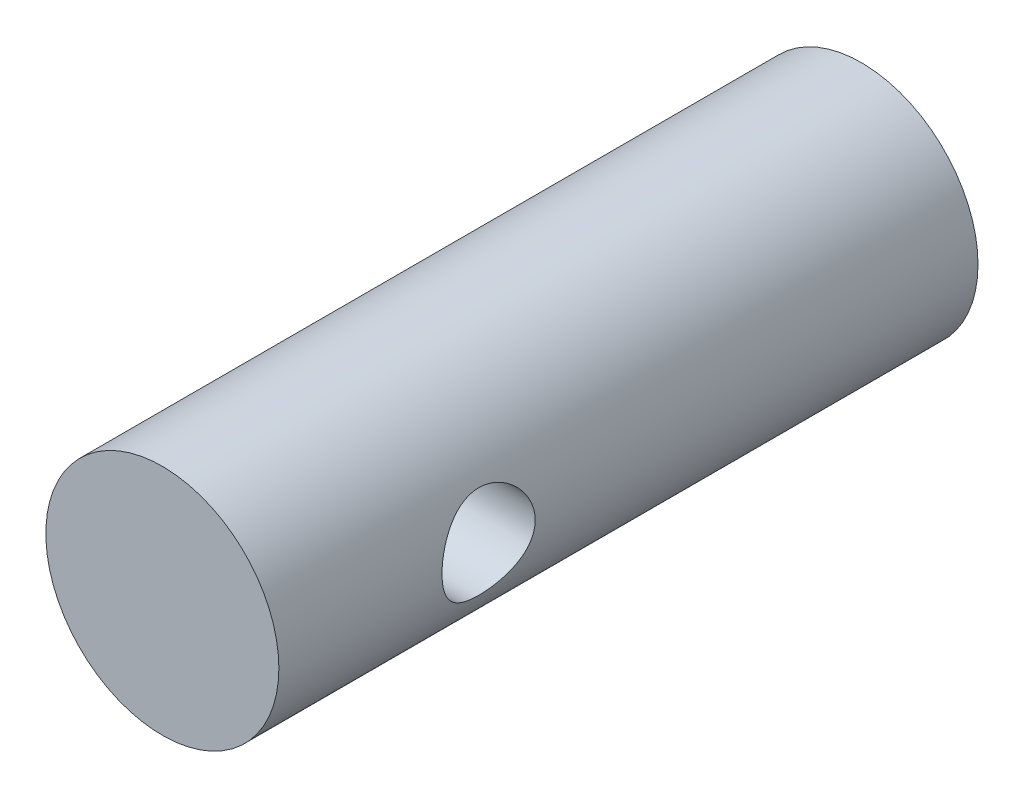
ISO-10303-21;
HEADER;
FILE_DESCRIPTION(('STEP AP214'),'2;1');
FILE_NAME('part.step','',(''),(''),'','','');
FILE_SCHEMA(('AUTOMOTIVE_DESIGN { 1 0 10303 214 1 1 1 1 }'));
ENDSEC;
DATA;
#1=APPLICATION_CONTEXT('core data for automotive mechanical design processes');
#2=APPLICATION_PROTOCOL_DEFINITION('international standard','automotive_design',2000,#1);
#3=PRODUCT_CONTEXT('',#1,'mechanical');
#4=PRODUCT('Part','Part','',(#3));
#5=PRODUCT_RELATED_PRODUCT_CATEGORY('part','',(#4));
#6=PRODUCT_DEFINITION_FORMATION('','',#4);
#7=PRODUCT_DEFINITION_CONTEXT('part definition',#1,'design');
#8=PRODUCT_DEFINITION('design','',#6,#7);
#9=PRODUCT_DEFINITION_SHAPE('','',#8);
#10=(LENGTH_UNIT() NAMED_UNIT(*) SI_UNIT(.MILLI.,.METRE.));
#11=(NAMED_UNIT(*) PLANE_ANGLE_UNIT() SI_UNIT($,.RADIAN.));
#12=(NAMED_UNIT(*) SI_UNIT($,.STERADIAN.) SOLID_ANGLE_UNIT());
#13=UNCERTAINTY_MEASURE_WITH_UNIT(LENGTH_MEASURE(1.E-05),#10,'distance_accuracy_value','');
#14=(GEOMETRIC_REPRESENTATION_CONTEXT(3) GLOBAL_UNCERTAINTY_ASSIGNED_CONTEXT((#13)) GLOBAL_UNIT_ASSIGNED_CONTEXT((#10,
#11,#12)) REPRESENTATION_CONTEXT('',''));
#15=CARTESIAN_POINT('',(0.,0.,0.));
#16=DIRECTION('',(0.,0.,1.));
#17=DIRECTION('',(1.,0.,0.));
#18=AXIS2_PLACEMENT_3D('',#15,#16,#17);
#19=CARTESIAN_POINT('',(0.,0.,-30.));
#20=DIRECTION('',(0.,0.,1.));
#21=DIRECTION('',(1.,0.,0.));
#22=AXIS2_PLACEMENT_3D('',#19,#20,#21);
#23=CYLINDRICAL_SURFACE('',#22,5.);
#24=CARTESIAN_POINT('',(5.,0.,-7.00000000000433));
#25=CARTESIAN_POINT('',(4.99999271227084,0.107493005442777,-7.00000985182806));
#26=CARTESIAN_POINT('',(4.99649294306933,0.215172564090361,-7.0087177520927));
#27=CARTESIAN_POINT('',(4.98283453100647,0.427496480417195,-7.0432477035255));
#28=CARTESIAN_POINT('',(4.97265778698886,0.532131777560356,-7.06911627909035));
#29=CARTESIAN_POINT('',(4.94674209213137,0.734953922726142,-7.13687607806294));
#30=CARTESIAN_POINT('',(4.93102136364096,0.83316066161552,-7.17871484622077));
#31=CARTESIAN_POINT('',(4.89556610796115,1.02107197032659,-7.27701917333043));
#32=CARTESIAN_POINT('',(4.87583297458101,1.11077947674905,-7.33347965492273));
#33=CARTESIAN_POINT('',(4.83330886170479,1.28350100756812,-7.46223549856452));
#34=CARTESIAN_POINT('',(4.8104229692926,1.36606227254777,-7.53510665624372));
#35=CARTESIAN_POINT('',(4.76460576906282,1.51817500478197,-7.69340000347996));
#36=CARTESIAN_POINT('',(4.74167444453889,1.58772010713064,-7.77882829721478));
#37=CARTESIAN_POINT('',(4.69722791797252,1.7148745672897,-7.96442807024496));
#38=CARTESIAN_POINT('',(4.67582115965077,1.77181498119216,-8.06508648602569));
#39=CARTESIAN_POINT('',(4.63833647186935,1.8677547190336,-8.27553639842211));
#40=CARTESIAN_POINT('',(4.62225601244326,1.90676256428219,-8.3853235278502));
#41=CARTESIAN_POINT('',(4.59826357660981,1.96389882339207,-8.60571233359349));
#42=CARTESIAN_POINT('',(4.59001420355771,1.9828939658018,-8.71605123557738));
#43=CARTESIAN_POINT('',(4.58164004049315,2.00217296163611,-8.93863499830798));
#44=CARTESIAN_POINT('',(4.5815112552294,2.00246601630929,-9.0508788946255));
#45=CARTESIAN_POINT('',(4.58910500280164,1.98498936750062,-9.26575667145813));
#46=CARTESIAN_POINT('',(4.59628175038618,1.96847531430122,-9.36851571440894));
#47=CARTESIAN_POINT('',(4.61676187607997,1.91994688029395,-9.56965955600628));
#48=CARTESIAN_POINT('',(4.63006632321829,1.88792979480079,-9.66804358810971));
#49=CARTESIAN_POINT('',(4.66159485088676,1.80869473254732,-9.8600178361951));
#50=CARTESIAN_POINT('',(4.67991379280927,1.76117986231162,-9.95346923905358));
#51=CARTESIAN_POINT('',(4.71938116390015,1.65250646072865,-10.1314158163601));
#52=CARTESIAN_POINT('',(4.74053065456965,1.59134280509735,-10.2159076094012));
#53=CARTESIAN_POINT('',(4.7852673674237,1.45155059945114,-10.3804097288001));
#54=CARTESIAN_POINT('',(4.80891664976242,1.37193746296747,-10.4595687294439));
#55=CARTESIAN_POINT('',(4.85459824958353,1.20031442742731,-10.6036844779996));
#56=CARTESIAN_POINT('',(4.87663024445386,1.10830206533171,-10.6686383974077));
#57=CARTESIAN_POINT('',(4.91714681264592,0.912077652603472,-10.7836174474129));
#58=CARTESIAN_POINT('',(4.9355527009545,0.807660491344309,-10.833322281194));
#59=CARTESIAN_POINT('',(4.96614828328779,0.591023765481147,-10.9141678610747));
#60=CARTESIAN_POINT('',(4.97834113462396,0.47880819684817,-10.945318037554));
#61=CARTESIAN_POINT('',(4.99456139506916,0.256895887606759,-10.9864482954161));
#62=CARTESIAN_POINT('',(4.99902945833516,0.147443293984685,-10.9975724542499));
#63=CARTESIAN_POINT('',(5.0006847851063,-0.0718453098082361,-11.0017131005249));
#64=CARTESIAN_POINT('',(4.9978739358229,-0.181681213224124,-10.9947342815438));
#65=CARTESIAN_POINT('',(4.98557567063754,-0.393432739121784,-10.9637082474443));
#66=CARTESIAN_POINT('',(4.97639391345527,-0.495482491775085,-10.9404420196453));
#67=CARTESIAN_POINT('',(4.9525944140551,-0.694135428060025,-10.8785642916865));
#68=CARTESIAN_POINT('',(4.93797597356545,-0.790737910223908,-10.8399508203277));
#69=CARTESIAN_POINT('',(4.90416594770837,-0.979078785815404,-10.7472150603165));
#70=CARTESIAN_POINT('',(4.88484815979835,-1.07057802275393,-10.6926545279533));
#71=CARTESIAN_POINT('',(4.84373364745571,-1.24344359124472,-10.570059676091));
#72=CARTESIAN_POINT('',(4.82193593110325,-1.32480584075912,-10.5020199570741));
#73=CARTESIAN_POINT('',(4.77645117638185,-1.48072304302646,-10.3491299870473));
#74=CARTESIAN_POINT('',(4.75273441425135,-1.55447393380352,-10.2634664584908));
#75=CARTESIAN_POINT('',(4.70741672917236,-1.68675119741082,-10.0805599169879));
#76=CARTESIAN_POINT('',(4.68581615526625,-1.74527506133445,-9.9833149996575));
#77=CARTESIAN_POINT('',(4.64714299907842,-1.84580750192825,-9.7785383054037));
#78=CARTESIAN_POINT('',(4.63011630884931,-1.88765059453093,-9.6709160007857));
#79=CARTESIAN_POINT('',(4.60323673478091,-1.95229621970153,-9.44926634828331));
#80=CARTESIAN_POINT('',(4.59337855696165,-1.97511280526544,-9.33524379418628));
#81=CARTESIAN_POINT('',(4.58271759300102,-1.99971561727437,-9.11287209822461));
#82=CARTESIAN_POINT('',(4.5813142100835,-2.00289708229878,-9.00470516040601));
#83=CARTESIAN_POINT('',(4.58614836033279,-1.99180315927335,-8.78945514228649));
#84=CARTESIAN_POINT('',(4.59238492324974,-1.97752998790958,-8.68237192609742));
#85=CARTESIAN_POINT('',(4.61126649079197,-1.93307136614943,-8.47666781014535));
#86=CARTESIAN_POINT('',(4.62364831827623,-1.90353749356675,-8.37787972556757));
#87=CARTESIAN_POINT('',(4.65324001232862,-1.8300054484868,-8.18662137038743));
#88=CARTESIAN_POINT('',(4.67045121206167,-1.78600328138962,-8.09415285310125));
#89=CARTESIAN_POINT('',(4.70898609604639,-1.68187276275559,-7.91239038073067));
#90=CARTESIAN_POINT('',(4.73048882313382,-1.6209653351554,-7.82358132987115));
#91=CARTESIAN_POINT('',(4.77463804372361,-1.48589211926752,-7.65700668279824));
#92=CARTESIAN_POINT('',(4.79728488048521,-1.41172233481421,-7.57924442787386));
#93=CARTESIAN_POINT('',(4.84293567087489,-1.24650550626875,-7.43179714673895));
#94=CARTESIAN_POINT('',(4.8658675796227,-1.15467600114256,-7.36296269310471));
#95=CARTESIAN_POINT('',(4.9080040671378,-0.959900320282507,-7.24166295738152));
#96=CARTESIAN_POINT('',(4.9272069109296,-0.856949004544136,-7.18920528785081));
#97=CARTESIAN_POINT('',(4.95939714815896,-0.644738062492482,-7.10337778481338));
#98=CARTESIAN_POINT('',(4.97249363055054,-0.535631618217184,-7.06967067644348));
#99=CARTESIAN_POINT('',(4.99144306209378,-0.312876546279158,-7.02136087904981));
#100=CARTESIAN_POINT('',(4.99731899495644,-0.199243525857088,-7.00669756326029));
#101=CARTESIAN_POINT('',(4.99975899504137,-0.0569122978898494,-7.00060461902604));
#102=CARTESIAN_POINT('',(5.00000192969176,-0.0284626887401764,-6.99999739137514));
#103=CARTESIAN_POINT('',(5.,0.,-7.00000000000433));
#104=B_SPLINE_CURVE_WITH_KNOTS('',3,(#24,#25,#26,#27,#28,#29,#30,#31,#32,#33,#34,#35,#36,#37,
#38,#39,#40,#41,#42,#43,#44,#45,#46,#47,#48,#49,#50,#51,#52,#53,#54,#55,#56,#57,#58,#59,#60,#61,
#62,#63,#64,#65,#66,#67,#68,#69,#70,#71,#72,#73,#74,#75,#76,#77,#78,#79,#80,#81,#82,#83,#84,#85,
#86,#87,#88,#89,#90,#91,#92,#93,#94,#95,#96,#97,#98,#99,#100,#101,#102,#103),.UNSPECIFIED.,.T.,
.F.,(4,2,2,2,2,2,2,2,2,2,2,2,2,2,2,2,2,2,2,2,2,2,2,2,2,2,2,2,2,2,2,2,2,2,2,2,2,2,2,4),(0.,
0.322402987892479,0.645683636006751,0.96791145746981,1.29002753567748,1.62597381700095,
1.96208394934044,2.31315258818773,2.66405423117748,2.9990410530824,3.33386306339832,
3.64538328400664,3.95695787255287,4.27489126298,4.59294421937312,4.93558349185616,
5.27829092838723,5.6277691316172,5.97706956112628,6.30569184526781,6.63422893568791,
6.9480045556302,7.26182048992396,7.58523513396804,7.90877959497453,8.25368474622828,
8.59864669042093,8.94695045139095,9.29499672644124,9.61799673390875,9.9409557256111,
10.2511431854678,10.5614163580313,10.889454680546,11.2175920134624,11.5670042353161,
11.9165786363823,12.2596430101094,12.6016125240189,12.686980458942),.UNSPECIFIED.);
#105=CARTESIAN_POINT('',(5.,0.,-7.00000000000433));
#106=VERTEX_POINT('',#105);
#107=EDGE_CURVE('E44',#106,#106,#104,.T.);
#108=ORIENTED_EDGE('',*,*,#107,.T.);
#109=EDGE_LOOP('',(#108));
#110=FACE_BOUND('',#109,.T.);
#111=CARTESIAN_POINT('',(-5.,0.,-7.00000000000433));
#112=CARTESIAN_POINT('',(-4.99999271227085,-0.107493005442693,-7.00000985182806));
#113=CARTESIAN_POINT('',(-4.99649294306934,-0.215172564090277,-7.0087177520927));
#114=CARTESIAN_POINT('',(-4.98283453100648,-0.42749648041711,-7.04324770352552));
#115=CARTESIAN_POINT('',(-4.97265778698887,-0.53213177756027,-7.06911627909037));
#116=CARTESIAN_POINT('',(-4.94674209213138,-0.734953922726053,-7.13687607806297));
#117=CARTESIAN_POINT('',(-4.93102136364098,-0.833160661615429,-7.17871484622081));
#118=CARTESIAN_POINT('',(-4.89556610796117,-1.02107197032649,-7.27701917333047));
#119=CARTESIAN_POINT('',(-4.87583297458103,-1.11077947674895,-7.33347965492277));
#120=CARTESIAN_POINT('',(-4.83330886170481,-1.28350100756801,-7.46223549856458));
#121=CARTESIAN_POINT('',(-4.81042296929262,-1.36606227254767,-7.53510665624378));
#122=CARTESIAN_POINT('',(-4.76460576906285,-1.51817500478186,-7.69340000348003));
#123=CARTESIAN_POINT('',(-4.74167444453893,-1.58772010713052,-7.77882829721485));
#124=CARTESIAN_POINT('',(-4.69722791797257,-1.71487456728958,-7.96442807024503));
#125=CARTESIAN_POINT('',(-4.67582115965082,-1.77181498119203,-8.06508648602576));
#126=CARTESIAN_POINT('',(-4.63833647186941,-1.86775471903346,-8.27553639842218));
#127=CARTESIAN_POINT('',(-4.62225601244332,-1.90676256428205,-8.38532352785027));
#128=CARTESIAN_POINT('',(-4.59826357660987,-1.96389882339192,-8.60571233359357));
#129=CARTESIAN_POINT('',(-4.59001420355778,-1.98289396580164,-8.71605123557746));
#130=CARTESIAN_POINT('',(-4.58164004049322,-2.00217296163595,-8.93863499830806));
#131=CARTESIAN_POINT('',(-4.58151125522948,-2.00246601630912,-9.05087889462558));
#132=CARTESIAN_POINT('',(-4.58910500280172,-1.98498936750044,-9.26575667145821));
#133=CARTESIAN_POINT('',(-4.59628175038625,-1.96847531430104,-9.36851571440902));
#134=CARTESIAN_POINT('',(-4.61676187608005,-1.91994688029376,-9.56965955600636));
#135=CARTESIAN_POINT('',(-4.63006632321837,-1.8879297948006,-9.66804358810978));
#136=CARTESIAN_POINT('',(-4.66159485088684,-1.80869473254712,-9.86001783619518));
#137=CARTESIAN_POINT('',(-4.67991379280935,-1.76117986231141,-9.95346923905366));
#138=CARTESIAN_POINT('',(-4.71938116390022,-1.65250646072843,-10.1314158163602));
#139=CARTESIAN_POINT('',(-4.74053065456973,-1.59134280509713,-10.2159076094013));
#140=CARTESIAN_POINT('',(-4.78526736742378,-1.4515505994509,-10.3804097288001));
#141=CARTESIAN_POINT('',(-4.80891664976249,-1.37193746296723,-10.459568729444));
#142=CARTESIAN_POINT('',(-4.85459824958359,-1.20031442742706,-10.6036844779996));
#143=CARTESIAN_POINT('',(-4.87663024445392,-1.10830206533145,-10.6686383974077));
#144=CARTESIAN_POINT('',(-4.91714681264597,-0.912077652603212,-10.783617447413));
#145=CARTESIAN_POINT('',(-4.93555270095454,-0.807660491344048,-10.833322281194));
#146=CARTESIAN_POINT('',(-4.96614828328782,-0.591023765480885,-10.9141678610748));
#147=CARTESIAN_POINT('',(-4.97834113462399,-0.478808196847907,-10.945318037554));
#148=CARTESIAN_POINT('',(-4.99456139506917,-0.256895887606498,-10.9864482954162));
#149=CARTESIAN_POINT('',(-4.99902945833517,-0.147443293984425,-10.9975724542499));
#150=CARTESIAN_POINT('',(-5.0006847851063,0.0718453098084924,-11.0017131005249));
#151=CARTESIAN_POINT('',(-4.99787393582289,0.181681213224377,-10.9947342815438));
#152=CARTESIAN_POINT('',(-4.98557567063752,0.393432739122034,-10.9637082474443));
#153=CARTESIAN_POINT('',(-4.97639391345524,0.495482491775334,-10.9404420196453));
#154=CARTESIAN_POINT('',(-4.95259441405507,0.694135428060269,-10.8785642916865));
#155=CARTESIAN_POINT('',(-4.93797597356541,0.79073791022415,-10.8399508203276));
#156=CARTESIAN_POINT('',(-4.90416594770832,0.979078785815641,-10.7472150603164));
#157=CARTESIAN_POINT('',(-4.8848481597983,1.07057802275416,-10.6926545279533));
#158=CARTESIAN_POINT('',(-4.84373364745565,1.24344359124496,-10.5700596760909));
#159=CARTESIAN_POINT('',(-4.82193593110319,1.32480584075936,-10.502019957074));
#160=CARTESIAN_POINT('',(-4.77645117638178,1.48072304302668,-10.3491299870472));
#161=CARTESIAN_POINT('',(-4.75273441425128,1.55447393380374,-10.2634664584907));
#162=CARTESIAN_POINT('',(-4.70741672917228,1.68675119741103,-10.0805599169878));
#163=CARTESIAN_POINT('',(-4.68581615526617,1.74527506133466,-9.98331499965741));
#164=CARTESIAN_POINT('',(-4.64714299907834,1.84580750192846,-9.77853830540361));
#165=CARTESIAN_POINT('',(-4.63011630884923,1.88765059453113,-9.67091600078561));
#166=CARTESIAN_POINT('',(-4.60323673478083,1.95229621970172,-9.44926634828321));
#167=CARTESIAN_POINT('',(-4.59337855696157,1.97511280526562,-9.33524379418618));
#168=CARTESIAN_POINT('',(-4.58271759300095,1.99971561727454,-9.11287209822451));
#169=CARTESIAN_POINT('',(-4.58131421008343,2.00289708229894,-9.00470516040591));
#170=CARTESIAN_POINT('',(-4.58614836033272,1.99180315927351,-8.7894551422864));
#171=CARTESIAN_POINT('',(-4.59238492324968,1.97752998790974,-8.68237192609733));
#172=CARTESIAN_POINT('',(-4.61126649079192,1.93307136614957,-8.47666781014527));
#173=CARTESIAN_POINT('',(-4.62364831827617,1.9035374935669,-8.37787972556749));
#174=CARTESIAN_POINT('',(-4.65324001232857,1.83000544848694,-8.18662137038736));
#175=CARTESIAN_POINT('',(-4.67045121206162,1.78600328138975,-8.09415285310119));
#176=CARTESIAN_POINT('',(-4.70898609604635,1.68187276275572,-7.9123903807306));
#177=CARTESIAN_POINT('',(-4.73048882313378,1.62096533515552,-7.82358132987109));
#178=CARTESIAN_POINT('',(-4.77463804372357,1.48589211926763,-7.65700668279819));
#179=CARTESIAN_POINT('',(-4.79728488048518,1.41172233481433,-7.57924442787381));
#180=CARTESIAN_POINT('',(-4.84293567087487,1.24650550626886,-7.43179714673891));
#181=CARTESIAN_POINT('',(-4.86586757962267,1.15467600114266,-7.36296269310466));
#182=CARTESIAN_POINT('',(-4.90800406713778,0.959900320282604,-7.24166295738149));
#183=CARTESIAN_POINT('',(-4.92720691092958,0.85694900454423,-7.18920528785078));
#184=CARTESIAN_POINT('',(-4.95939714815895,0.644738062492572,-7.10337778481335));
#185=CARTESIAN_POINT('',(-4.97249363055053,0.535631618217274,-7.06967067644346));
#186=CARTESIAN_POINT('',(-4.99144306209378,0.312876546279244,-7.0213608790498));
#187=CARTESIAN_POINT('',(-4.99731899495644,0.199243525857173,-7.00669756326028));
#188=CARTESIAN_POINT('',(-4.99975899504137,0.0569122978899335,-7.00060461902604));
#189=CARTESIAN_POINT('',(-5.00000192969176,0.0284626887402601,-6.99999739137514));
#190=CARTESIAN_POINT('',(-5.,0.,-7.00000000000433));
#191=B_SPLINE_CURVE_WITH_KNOTS('',3,(#111,#112,#113,#114,#115,#116,#117,#118,#119,#120,#121,
#122,#123,#124,#125,#126,#127,#128,#129,#130,#131,#132,#133,#134,#135,#136,#137,#138,#139,#140,
#141,#142,#143,#144,#145,#146,#147,#148,#149,#150,#151,#152,#153,#154,#155,#156,#157,#158,#159,
#160,#161,#162,#163,#164,#165,#166,#167,#168,#169,#170,#171,#172,#173,#174,#175,#176,#177,#178,
#179,#180,#181,#182,#183,#184,#185,#186,#187,#188,#189,#190),.UNSPECIFIED.,.T.,.F.,(4,2,2,2,2,2,
2,2,2,2,2,2,2,2,2,2,2,2,2,2,2,2,2,2,2,2,2,2,2,2,2,2,2,2,2,2,2,2,2,4),(0.,0.322402987892479,
0.64568363600675,0.967911457469809,1.29002753567748,1.62597381700095,1.96208394934043,
2.31315258818772,2.66405423117747,2.99904105308239,3.3338630633983,3.64538328400662,
3.95695787255286,4.27489126298,4.59294421937313,4.93558349185617,5.27829092838723,
5.6277691316172,5.97706956112628,6.30569184526779,6.63422893568789,6.94800455563017,
7.26182048992394,7.58523513396803,7.90877959497452,8.25368474622828,8.59864669042093,
8.94695045139095,9.29499672644124,9.61799673390875,9.94095572561109,10.2511431854678,
10.5614163580312,10.889454680546,11.2175920134624,11.5670042353161,11.9165786363823,
12.2596430101094,12.6016125240189,12.686980458942),.UNSPECIFIED.);
#192=CARTESIAN_POINT('',(-5.,0.,-7.00000000000433));
#193=VERTEX_POINT('',#192);
#194=EDGE_CURVE('E53',#193,#193,#191,.T.);
#195=ORIENTED_EDGE('',*,*,#194,.T.);
#196=EDGE_LOOP('',(#195));
#197=FACE_BOUND('',#196,.T.);
#198=CARTESIAN_POINT('',(0.,0.,-30.));
#199=DIRECTION('',(0.,0.,1.));
#200=DIRECTION('',(1.,0.,0.));
#201=AXIS2_PLACEMENT_3D('',#198,#199,#200);
#202=CIRCLE('',#201,5.);
#203=CARTESIAN_POINT('',(5.,0.,-30.));
#204=VERTEX_POINT('',#203);
#205=EDGE_CURVE('E10',#204,#204,#202,.T.);
#206=ORIENTED_EDGE('',*,*,#205,.T.);
#207=EDGE_LOOP('',(#206));
#208=FACE_BOUND('',#207,.T.);
#209=CARTESIAN_POINT('',(0.,0.,0.));
#210=DIRECTION('',(0.,0.,1.));
#211=DIRECTION('',(1.,0.,0.));
#212=AXIS2_PLACEMENT_3D('',#209,#210,#211);
#213=CIRCLE('',#212,5.);
#214=CARTESIAN_POINT('',(5.,0.,0.));
#215=VERTEX_POINT('',#214);
#216=EDGE_CURVE('E37',#215,#215,#213,.T.);
#217=ORIENTED_EDGE('',*,*,#216,.F.);
#218=EDGE_LOOP('',(#217));
#219=FACE_BOUND('',#218,.T.);
#220=ADVANCED_FACE('F34',(#110,#197,#208,#219),#23,.T.);
#221=CARTESIAN_POINT('',(0.,0.,-30.));
#222=DIRECTION('',(0.,0.,1.));
#223=DIRECTION('',(1.,0.,0.));
#224=AXIS2_PLACEMENT_3D('',#221,#222,#223);
#225=PLANE('',#224);
#226=ORIENTED_EDGE('',*,*,#205,.F.);
#227=EDGE_LOOP('',(#226));
#228=FACE_BOUND('',#227,.T.);
#229=ADVANCED_FACE('F65',(#228),#225,.F.);
#230=CARTESIAN_POINT('',(0.,0.,0.));
#231=DIRECTION('',(0.,0.,1.));
#232=DIRECTION('',(1.,0.,0.));
#233=AXIS2_PLACEMENT_3D('',#230,#231,#232);
#234=PLANE('',#233);
#235=ORIENTED_EDGE('',*,*,#216,.T.);
#236=EDGE_LOOP('',(#235));
#237=FACE_BOUND('',#236,.T.);
#238=ADVANCED_FACE('F63',(#237),#234,.T.);
#239=CARTESIAN_POINT('',(5.001,0.,-9.00000000000033));
#240=DIRECTION('',(-1.,0.,0.));
#241=DIRECTION('',(0.,0.,1.));
#242=AXIS2_PLACEMENT_3D('',#239,#240,#241);
#243=CYLINDRICAL_SURFACE('',#242,1.999999999996);
#244=ORIENTED_EDGE('',*,*,#107,.F.);
#245=EDGE_LOOP('',(#244));
#246=FACE_BOUND('',#245,.T.);
#247=ORIENTED_EDGE('',*,*,#194,.F.);
#248=EDGE_LOOP('',(#247));
#249=FACE_BOUND('',#248,.T.);
#250=ADVANCED_FACE('F57',(#246,#249),#243,.F.);
#251=CLOSED_SHELL('',(#220,#229,#238,#250));
#252=MANIFOLD_SOLID_BREP('B2',#251);
#253=ADVANCED_BREP_SHAPE_REPRESENTATION('',(#18,#252),#14);
#254=SHAPE_DEFINITION_REPRESENTATION(#9,#253);
ENDSEC;
END-ISO-10303-21;
